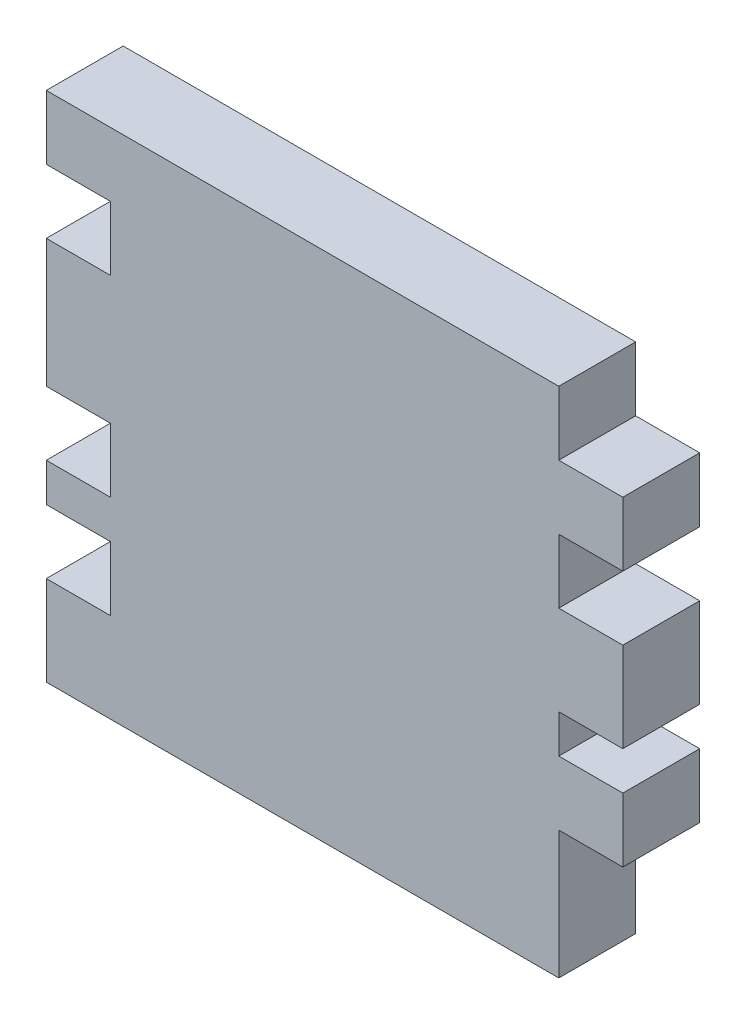
ISO-10303-21;
HEADER;
FILE_DESCRIPTION(('STEP AP214'),'2;1');
FILE_NAME('part.step','',(''),(''),'','','');
FILE_SCHEMA(('AUTOMOTIVE_DESIGN { 1 0 10303 214 1 1 1 1 }'));
ENDSEC;
DATA;
#1=APPLICATION_CONTEXT('core data for automotive mechanical design processes');
#2=APPLICATION_PROTOCOL_DEFINITION('international standard','automotive_design',2000,#1);
#3=PRODUCT_CONTEXT('',#1,'mechanical');
#4=PRODUCT('Part','Part','',(#3));
#5=PRODUCT_RELATED_PRODUCT_CATEGORY('part','',(#4));
#6=PRODUCT_DEFINITION_FORMATION('','',#4);
#7=PRODUCT_DEFINITION_CONTEXT('part definition',#1,'design');
#8=PRODUCT_DEFINITION('design','',#6,#7);
#9=PRODUCT_DEFINITION_SHAPE('','',#8);
#10=(LENGTH_UNIT() NAMED_UNIT(*) SI_UNIT(.MILLI.,.METRE.));
#11=(NAMED_UNIT(*) PLANE_ANGLE_UNIT() SI_UNIT($,.RADIAN.));
#12=(NAMED_UNIT(*) SI_UNIT($,.STERADIAN.) SOLID_ANGLE_UNIT());
#13=UNCERTAINTY_MEASURE_WITH_UNIT(LENGTH_MEASURE(1.E-05),#10,'distance_accuracy_value','');
#14=(GEOMETRIC_REPRESENTATION_CONTEXT(3) GLOBAL_UNCERTAINTY_ASSIGNED_CONTEXT((#13)) GLOBAL_UNIT_ASSIGNED_CONTEXT((#10,
#11,#12)) REPRESENTATION_CONTEXT('',''));
#15=CARTESIAN_POINT('',(0.,0.,0.));
#16=DIRECTION('',(0.,0.,1.));
#17=DIRECTION('',(1.,0.,0.));
#18=AXIS2_PLACEMENT_3D('',#15,#16,#17);
#19=CARTESIAN_POINT('',(0.,0.,6.));
#20=DIRECTION('',(0.,0.,-1.));
#21=DIRECTION('',(-1.,0.,0.));
#22=AXIS2_PLACEMENT_3D('',#19,#20,#21);
#23=PLANE('',#22);
#24=DIRECTION('',(-1.,0.,0.));
#25=VECTOR('',#24,1.);
#26=CARTESIAN_POINT('',(23.7388987566607,12.3845470692718,6.));
#27=LINE('',#26,#25);
#28=CARTESIAN_POINT('',(23.7388987566607,12.3845470692718,6.));
#29=VERTEX_POINT('',#28);
#30=CARTESIAN_POINT('',(18.7388987566607,12.3845470692718,6.));
#31=VERTEX_POINT('',#30);
#32=EDGE_CURVE('E248',#29,#31,#27,.T.);
#33=ORIENTED_EDGE('',*,*,#32,.T.);
#34=DIRECTION('',(0.,-1.,0.));
#35=VECTOR('',#34,1.);
#36=CARTESIAN_POINT('',(18.7388987566607,17.3845470692718,6.));
#37=LINE('',#36,#35);
#38=CARTESIAN_POINT('',(18.7388987566607,17.3845470692718,6.));
#39=VERTEX_POINT('',#38);
#40=EDGE_CURVE('E230',#39,#31,#37,.T.);
#41=ORIENTED_EDGE('',*,*,#40,.F.);
#42=DIRECTION('',(1.,0.,0.));
#43=VECTOR('',#42,1.);
#44=CARTESIAN_POINT('',(-21.2611012433392,17.3845470692718,6.));
#45=LINE('',#44,#43);
#46=CARTESIAN_POINT('',(-21.2611012433392,17.3845470692718,6.));
#47=VERTEX_POINT('',#46);
#48=EDGE_CURVE('E404',#47,#39,#45,.T.);
#49=ORIENTED_EDGE('',*,*,#48,.F.);
#50=DIRECTION('',(0.,-1.,0.));
#51=VECTOR('',#50,1.);
#52=CARTESIAN_POINT('',(-21.2611012433392,17.3845470692718,6.));
#53=LINE('',#52,#51);
#54=CARTESIAN_POINT('',(-21.2611012433393,12.3845470692718,6.));
#55=VERTEX_POINT('',#54);
#56=EDGE_CURVE('E408',#47,#55,#53,.T.);
#57=ORIENTED_EDGE('',*,*,#56,.T.);
#58=DIRECTION('',(1.,0.,0.));
#59=VECTOR('',#58,1.);
#60=CARTESIAN_POINT('',(-21.2611012433393,12.3845470692718,6.));
#61=LINE('',#60,#59);
#62=CARTESIAN_POINT('',(-16.2611012433393,12.3845470692718,6.));
#63=VERTEX_POINT('',#62);
#64=EDGE_CURVE('E328',#55,#63,#61,.T.);
#65=ORIENTED_EDGE('',*,*,#64,.T.);
#66=DIRECTION('',(0.,1.,0.));
#67=VECTOR('',#66,1.);
#68=CARTESIAN_POINT('',(-16.2611012433393,7.38454706927176,6.));
#69=LINE('',#68,#67);
#70=CARTESIAN_POINT('',(-16.2611012433393,7.38454706927176,6.));
#71=VERTEX_POINT('',#70);
#72=EDGE_CURVE('E331',#71,#63,#69,.T.);
#73=ORIENTED_EDGE('',*,*,#72,.F.);
#74=DIRECTION('',(1.,0.,0.));
#75=VECTOR('',#74,1.);
#76=CARTESIAN_POINT('',(-21.2611012433392,7.38454706927176,6.));
#77=LINE('',#76,#75);
#78=CARTESIAN_POINT('',(-21.2611012433392,7.38454706927176,6.));
#79=VERTEX_POINT('',#78);
#80=EDGE_CURVE('E321',#79,#71,#77,.T.);
#81=ORIENTED_EDGE('',*,*,#80,.F.);
#82=CARTESIAN_POINT('',(-21.2611012433393,-2.61545293072824,6.));
#83=VERTEX_POINT('',#82);
#84=EDGE_CURVE('E411',#79,#83,#53,.T.);
#85=ORIENTED_EDGE('',*,*,#84,.T.);
#86=DIRECTION('',(1.,0.,0.));
#87=VECTOR('',#86,1.);
#88=CARTESIAN_POINT('',(-21.2611012433393,-2.61545293072824,6.));
#89=LINE('',#88,#87);
#90=CARTESIAN_POINT('',(-16.2611012433393,-2.61545293072824,6.));
#91=VERTEX_POINT('',#90);
#92=EDGE_CURVE('E332',#83,#91,#89,.T.);
#93=ORIENTED_EDGE('',*,*,#92,.T.);
#94=DIRECTION('',(0.,1.,0.));
#95=VECTOR('',#94,1.);
#96=CARTESIAN_POINT('',(-16.2611012433393,-7.61545293072824,6.));
#97=LINE('',#96,#95);
#98=CARTESIAN_POINT('',(-16.2611012433393,-7.61545293072824,6.));
#99=VERTEX_POINT('',#98);
#100=EDGE_CURVE('E360',#99,#91,#97,.T.);
#101=ORIENTED_EDGE('',*,*,#100,.F.);
#102=DIRECTION('',(1.,0.,0.));
#103=VECTOR('',#102,1.);
#104=CARTESIAN_POINT('',(-21.2611012433392,-7.61545293072824,6.));
#105=LINE('',#104,#103);
#106=CARTESIAN_POINT('',(-21.2611012433392,-7.61545293072824,6.));
#107=VERTEX_POINT('',#106);
#108=EDGE_CURVE('E357',#107,#99,#105,.T.);
#109=ORIENTED_EDGE('',*,*,#108,.F.);
#110=CARTESIAN_POINT('',(-21.2611012433392,-10.6154529307282,6.));
#111=VERTEX_POINT('',#110);
#112=EDGE_CURVE('E439',#107,#111,#53,.T.);
#113=ORIENTED_EDGE('',*,*,#112,.T.);
#114=DIRECTION('',(1.,0.,0.));
#115=VECTOR('',#114,1.);
#116=CARTESIAN_POINT('',(-21.2611012433393,-10.6154529307282,6.));
#117=LINE('',#116,#115);
#118=CARTESIAN_POINT('',(-16.2611012433392,-10.6154529307282,6.));
#119=VERTEX_POINT('',#118);
#120=EDGE_CURVE('E381',#111,#119,#117,.T.);
#121=ORIENTED_EDGE('',*,*,#120,.T.);
#122=DIRECTION('',(0.,-1.,0.));
#123=VECTOR('',#122,1.);
#124=CARTESIAN_POINT('',(-16.2611012433392,-10.6154529307282,6.));
#125=LINE('',#124,#123);
#126=CARTESIAN_POINT('',(-16.2611012433392,-15.6154529307282,6.));
#127=VERTEX_POINT('',#126);
#128=EDGE_CURVE('E384',#119,#127,#125,.T.);
#129=ORIENTED_EDGE('',*,*,#128,.T.);
#130=DIRECTION('',(1.,0.,0.));
#131=VECTOR('',#130,1.);
#132=CARTESIAN_POINT('',(-21.2611012433392,-15.6154529307282,6.));
#133=LINE('',#132,#131);
#134=CARTESIAN_POINT('',(-21.2611012433392,-15.6154529307282,6.));
#135=VERTEX_POINT('',#134);
#136=EDGE_CURVE('E349',#135,#127,#133,.T.);
#137=ORIENTED_EDGE('',*,*,#136,.F.);
#138=CARTESIAN_POINT('',(-21.2611012433392,-22.6154529307282,6.));
#139=VERTEX_POINT('',#138);
#140=EDGE_CURVE('E407',#135,#139,#53,.T.);
#141=ORIENTED_EDGE('',*,*,#140,.T.);
#142=DIRECTION('',(1.,0.,0.));
#143=VECTOR('',#142,1.);
#144=CARTESIAN_POINT('',(-21.2611012433392,-22.6154529307282,6.));
#145=LINE('',#144,#143);
#146=CARTESIAN_POINT('',(18.7388987566607,-22.6154529307282,6.));
#147=VERTEX_POINT('',#146);
#148=EDGE_CURVE('E395',#139,#147,#145,.T.);
#149=ORIENTED_EDGE('',*,*,#148,.T.);
#150=DIRECTION('',(0.,-1.,0.));
#151=VECTOR('',#150,1.);
#152=CARTESIAN_POINT('',(18.7388987566607,-12.6154529307282,6.));
#153=LINE('',#152,#151);
#154=CARTESIAN_POINT('',(18.7388987566607,-12.6154529307282,6.));
#155=VERTEX_POINT('',#154);
#156=EDGE_CURVE('E280',#155,#147,#153,.T.);
#157=ORIENTED_EDGE('',*,*,#156,.F.);
#158=DIRECTION('',(-1.,0.,0.));
#159=VECTOR('',#158,1.);
#160=CARTESIAN_POINT('',(23.7388987566607,-12.6154529307282,6.));
#161=LINE('',#160,#159);
#162=CARTESIAN_POINT('',(23.7388987566607,-12.6154529307282,6.));
#163=VERTEX_POINT('',#162);
#164=EDGE_CURVE('E309',#163,#155,#161,.T.);
#165=ORIENTED_EDGE('',*,*,#164,.F.);
#166=DIRECTION('',(0.,-1.,0.));
#167=VECTOR('',#166,1.);
#168=CARTESIAN_POINT('',(23.7388987566607,17.3845470692718,6.));
#169=LINE('',#168,#167);
#170=CARTESIAN_POINT('',(23.7388987566607,-7.61545293072824,6.));
#171=VERTEX_POINT('',#170);
#172=EDGE_CURVE('E398',#171,#163,#169,.T.);
#173=ORIENTED_EDGE('',*,*,#172,.F.);
#174=DIRECTION('',(-1.,0.,0.));
#175=VECTOR('',#174,1.);
#176=CARTESIAN_POINT('',(23.7388987566607,-7.61545293072824,6.));
#177=LINE('',#176,#175);
#178=CARTESIAN_POINT('',(18.7388987566607,-7.61545293072824,6.));
#179=VERTEX_POINT('',#178);
#180=EDGE_CURVE('E256',#171,#179,#177,.T.);
#181=ORIENTED_EDGE('',*,*,#180,.T.);
#182=DIRECTION('',(0.,-1.,0.));
#183=VECTOR('',#182,1.);
#184=CARTESIAN_POINT('',(18.7388987566607,-4.61545293072824,6.));
#185=LINE('',#184,#183);
#186=CARTESIAN_POINT('',(18.7388987566607,-4.61545293072824,6.));
#187=VERTEX_POINT('',#186);
#188=EDGE_CURVE('E290',#187,#179,#185,.T.);
#189=ORIENTED_EDGE('',*,*,#188,.F.);
#190=DIRECTION('',(-1.,0.,0.));
#191=VECTOR('',#190,1.);
#192=CARTESIAN_POINT('',(23.7388987566607,-4.61545293072824,6.));
#193=LINE('',#192,#191);
#194=CARTESIAN_POINT('',(23.7388987566607,-4.61545293072824,6.));
#195=VERTEX_POINT('',#194);
#196=EDGE_CURVE('E287',#195,#187,#193,.T.);
#197=ORIENTED_EDGE('',*,*,#196,.F.);
#198=CARTESIAN_POINT('',(23.7388987566607,2.38454706927176,6.));
#199=VERTEX_POINT('',#198);
#200=EDGE_CURVE('E402',#199,#195,#169,.T.);
#201=ORIENTED_EDGE('',*,*,#200,.F.);
#202=DIRECTION('',(-1.,0.,0.));
#203=VECTOR('',#202,1.);
#204=CARTESIAN_POINT('',(23.7388987566607,2.38454706927176,6.));
#205=LINE('',#204,#203);
#206=CARTESIAN_POINT('',(18.7388987566607,2.38454706927176,6.));
#207=VERTEX_POINT('',#206);
#208=EDGE_CURVE('E250',#199,#207,#205,.T.);
#209=ORIENTED_EDGE('',*,*,#208,.T.);
#210=DIRECTION('',(0.,-1.,0.));
#211=VECTOR('',#210,1.);
#212=CARTESIAN_POINT('',(18.7388987566607,7.38454706927176,6.));
#213=LINE('',#212,#211);
#214=CARTESIAN_POINT('',(18.7388987566607,7.38454706927176,6.));
#215=VERTEX_POINT('',#214);
#216=EDGE_CURVE('E266',#215,#207,#213,.T.);
#217=ORIENTED_EDGE('',*,*,#216,.F.);
#218=DIRECTION('',(-1.,0.,0.));
#219=VECTOR('',#218,1.);
#220=CARTESIAN_POINT('',(23.7388987566607,7.38454706927176,6.));
#221=LINE('',#220,#219);
#222=CARTESIAN_POINT('',(23.7388987566607,7.38454706927176,6.));
#223=VERTEX_POINT('',#222);
#224=EDGE_CURVE('E263',#223,#215,#221,.T.);
#225=ORIENTED_EDGE('',*,*,#224,.F.);
#226=EDGE_CURVE('E403',#29,#223,#169,.T.);
#227=ORIENTED_EDGE('',*,*,#226,.F.);
#228=EDGE_LOOP('',(#33,#41,#49,#57,#65,#73,#81,#85,#93,#101,#109,#113,#121,#129,#137,#141,#149,
#157,#165,#173,#181,#189,#197,#201,#209,#217,#225,#227));
#229=FACE_BOUND('',#228,.T.);
#230=ADVANCED_FACE('F35',(#229),#23,.F.);
#231=CARTESIAN_POINT('',(0.,0.,0.));
#232=DIRECTION('',(0.,0.,-1.));
#233=DIRECTION('',(-1.,0.,0.));
#234=AXIS2_PLACEMENT_3D('',#231,#232,#233);
#235=PLANE('',#234);
#236=DIRECTION('',(0.,-1.,0.));
#237=VECTOR('',#236,1.);
#238=CARTESIAN_POINT('',(18.7388987566607,17.3845470692718,0.));
#239=LINE('',#238,#237);
#240=CARTESIAN_POINT('',(18.7388987566607,17.3845470692718,0.));
#241=VERTEX_POINT('',#240);
#242=CARTESIAN_POINT('',(18.7388987566607,12.3845470692718,0.));
#243=VERTEX_POINT('',#242);
#244=EDGE_CURVE('E229',#241,#243,#239,.T.);
#245=ORIENTED_EDGE('',*,*,#244,.T.);
#246=DIRECTION('',(-1.,0.,0.));
#247=VECTOR('',#246,1.);
#248=CARTESIAN_POINT('',(23.7388987566607,12.3845470692718,0.));
#249=LINE('',#248,#247);
#250=CARTESIAN_POINT('',(23.7388987566607,12.3845470692718,0.));
#251=VERTEX_POINT('',#250);
#252=EDGE_CURVE('E218',#251,#243,#249,.T.);
#253=ORIENTED_EDGE('',*,*,#252,.F.);
#254=DIRECTION('',(0.,-1.,0.));
#255=VECTOR('',#254,1.);
#256=CARTESIAN_POINT('',(23.7388987566607,17.3845470692718,0.));
#257=LINE('',#256,#255);
#258=CARTESIAN_POINT('',(23.7388987566607,7.38454706927176,0.));
#259=VERTEX_POINT('',#258);
#260=EDGE_CURVE('E418',#251,#259,#257,.T.);
#261=ORIENTED_EDGE('',*,*,#260,.T.);
#262=DIRECTION('',(-1.,0.,0.));
#263=VECTOR('',#262,1.);
#264=CARTESIAN_POINT('',(23.7388987566607,7.38454706927176,0.));
#265=LINE('',#264,#263);
#266=CARTESIAN_POINT('',(18.7388987566607,7.38454706927176,0.));
#267=VERTEX_POINT('',#266);
#268=EDGE_CURVE('E58',#259,#267,#265,.T.);
#269=ORIENTED_EDGE('',*,*,#268,.T.);
#270=DIRECTION('',(0.,-1.,0.));
#271=VECTOR('',#270,1.);
#272=CARTESIAN_POINT('',(18.7388987566607,7.38454706927176,0.));
#273=LINE('',#272,#271);
#274=CARTESIAN_POINT('',(18.7388987566607,2.38454706927176,0.));
#275=VERTEX_POINT('',#274);
#276=EDGE_CURVE('E273',#267,#275,#273,.T.);
#277=ORIENTED_EDGE('',*,*,#276,.T.);
#278=DIRECTION('',(-1.,0.,0.));
#279=VECTOR('',#278,1.);
#280=CARTESIAN_POINT('',(23.7388987566607,2.38454706927176,0.));
#281=LINE('',#280,#279);
#282=CARTESIAN_POINT('',(23.7388987566607,2.38454706927176,0.));
#283=VERTEX_POINT('',#282);
#284=EDGE_CURVE('E267',#283,#275,#281,.T.);
#285=ORIENTED_EDGE('',*,*,#284,.F.);
#286=CARTESIAN_POINT('',(23.7388987566608,-4.61545293072825,0.));
#287=VERTEX_POINT('',#286);
#288=EDGE_CURVE('E417',#283,#287,#257,.T.);
#289=ORIENTED_EDGE('',*,*,#288,.T.);
#290=DIRECTION('',(-1.,0.,0.));
#291=VECTOR('',#290,1.);
#292=CARTESIAN_POINT('',(23.7388987566607,-4.61545293072824,0.));
#293=LINE('',#292,#291);
#294=CARTESIAN_POINT('',(18.7388987566607,-4.61545293072824,0.));
#295=VERTEX_POINT('',#294);
#296=EDGE_CURVE('E50',#287,#295,#293,.T.);
#297=ORIENTED_EDGE('',*,*,#296,.T.);
#298=DIRECTION('',(0.,-1.,0.));
#299=VECTOR('',#298,1.);
#300=CARTESIAN_POINT('',(18.7388987566607,-4.61545293072824,0.));
#301=LINE('',#300,#299);
#302=CARTESIAN_POINT('',(18.7388987566607,-7.61545293072824,0.));
#303=VERTEX_POINT('',#302);
#304=EDGE_CURVE('E297',#295,#303,#301,.T.);
#305=ORIENTED_EDGE('',*,*,#304,.T.);
#306=DIRECTION('',(-1.,0.,0.));
#307=VECTOR('',#306,1.);
#308=CARTESIAN_POINT('',(23.7388987566607,-7.61545293072824,0.));
#309=LINE('',#308,#307);
#310=CARTESIAN_POINT('',(23.7388987566607,-7.61545293072824,0.));
#311=VERTEX_POINT('',#310);
#312=EDGE_CURVE('E291',#311,#303,#309,.T.);
#313=ORIENTED_EDGE('',*,*,#312,.F.);
#314=CARTESIAN_POINT('',(23.7388987566607,-12.6154529307282,0.));
#315=VERTEX_POINT('',#314);
#316=EDGE_CURVE('E414',#311,#315,#257,.T.);
#317=ORIENTED_EDGE('',*,*,#316,.T.);
#318=DIRECTION('',(-1.,0.,0.));
#319=VECTOR('',#318,1.);
#320=CARTESIAN_POINT('',(23.7388987566607,-12.6154529307282,0.));
#321=LINE('',#320,#319);
#322=CARTESIAN_POINT('',(18.7388987566607,-12.6154529307282,0.));
#323=VERTEX_POINT('',#322);
#324=EDGE_CURVE('E308',#315,#323,#321,.T.);
#325=ORIENTED_EDGE('',*,*,#324,.T.);
#326=DIRECTION('',(0.,-1.,0.));
#327=VECTOR('',#326,1.);
#328=CARTESIAN_POINT('',(18.7388987566607,-12.6154529307282,0.));
#329=LINE('',#328,#327);
#330=CARTESIAN_POINT('',(18.7388987566607,-22.6154529307282,0.));
#331=VERTEX_POINT('',#330);
#332=EDGE_CURVE('E312',#323,#331,#329,.T.);
#333=ORIENTED_EDGE('',*,*,#332,.T.);
#334=DIRECTION('',(1.,0.,0.));
#335=VECTOR('',#334,1.);
#336=CARTESIAN_POINT('',(-21.2611012433392,-22.6154529307282,0.));
#337=LINE('',#336,#335);
#338=CARTESIAN_POINT('',(-21.2611012433392,-22.6154529307282,0.));
#339=VERTEX_POINT('',#338);
#340=EDGE_CURVE('E345',#339,#331,#337,.T.);
#341=ORIENTED_EDGE('',*,*,#340,.F.);
#342=DIRECTION('',(0.,-1.,0.));
#343=VECTOR('',#342,1.);
#344=CARTESIAN_POINT('',(-21.2611012433392,17.3845470692718,0.));
#345=LINE('',#344,#343);
#346=CARTESIAN_POINT('',(-21.2611012433392,-15.6154529307282,0.));
#347=VERTEX_POINT('',#346);
#348=EDGE_CURVE('E420',#347,#339,#345,.T.);
#349=ORIENTED_EDGE('',*,*,#348,.F.);
#350=DIRECTION('',(1.,0.,0.));
#351=VECTOR('',#350,1.);
#352=CARTESIAN_POINT('',(-21.2611012433392,-15.6154529307282,0.));
#353=LINE('',#352,#351);
#354=CARTESIAN_POINT('',(-16.2611012433392,-15.6154529307282,0.));
#355=VERTEX_POINT('',#354);
#356=EDGE_CURVE('E385',#347,#355,#353,.T.);
#357=ORIENTED_EDGE('',*,*,#356,.T.);
#358=DIRECTION('',(0.,-1.,0.));
#359=VECTOR('',#358,1.);
#360=CARTESIAN_POINT('',(-16.2611012433392,-10.6154529307282,0.));
#361=LINE('',#360,#359);
#362=CARTESIAN_POINT('',(-16.2611012433392,-10.6154529307282,0.));
#363=VERTEX_POINT('',#362);
#364=EDGE_CURVE('E391',#363,#355,#361,.T.);
#365=ORIENTED_EDGE('',*,*,#364,.F.);
#366=DIRECTION('',(1.,0.,0.));
#367=VECTOR('',#366,1.);
#368=CARTESIAN_POINT('',(-21.2611012433393,-10.6154529307282,0.));
#369=LINE('',#368,#367);
#370=CARTESIAN_POINT('',(-21.2611012433393,-10.6154529307282,0.));
#371=VERTEX_POINT('',#370);
#372=EDGE_CURVE('E374',#371,#363,#369,.T.);
#373=ORIENTED_EDGE('',*,*,#372,.F.);
#374=CARTESIAN_POINT('',(-21.2611012433392,-7.61545293072824,0.));
#375=VERTEX_POINT('',#374);
#376=EDGE_CURVE('E466',#375,#371,#345,.T.);
#377=ORIENTED_EDGE('',*,*,#376,.F.);
#378=DIRECTION('',(1.,0.,0.));
#379=VECTOR('',#378,1.);
#380=CARTESIAN_POINT('',(-21.2611012433392,-7.61545293072824,0.));
#381=LINE('',#380,#379);
#382=CARTESIAN_POINT('',(-16.2611012433393,-7.61545293072824,0.));
#383=VERTEX_POINT('',#382);
#384=EDGE_CURVE('E356',#375,#383,#381,.T.);
#385=ORIENTED_EDGE('',*,*,#384,.T.);
#386=DIRECTION('',(0.,1.,0.));
#387=VECTOR('',#386,1.);
#388=CARTESIAN_POINT('',(-16.2611012433393,-7.61545293072824,0.));
#389=LINE('',#388,#387);
#390=CARTESIAN_POINT('',(-16.2611012433393,-2.61545293072824,0.));
#391=VERTEX_POINT('',#390);
#392=EDGE_CURVE('E368',#383,#391,#389,.T.);
#393=ORIENTED_EDGE('',*,*,#392,.T.);
#394=DIRECTION('',(1.,0.,0.));
#395=VECTOR('',#394,1.);
#396=CARTESIAN_POINT('',(-21.2611012433393,-2.61545293072824,0.));
#397=LINE('',#396,#395);
#398=CARTESIAN_POINT('',(-21.2611012433393,-2.61545293072824,0.));
#399=VERTEX_POINT('',#398);
#400=EDGE_CURVE('E361',#399,#391,#397,.T.);
#401=ORIENTED_EDGE('',*,*,#400,.F.);
#402=CARTESIAN_POINT('',(-21.2611012433392,7.38454706927176,0.));
#403=VERTEX_POINT('',#402);
#404=EDGE_CURVE('E422',#403,#399,#345,.T.);
#405=ORIENTED_EDGE('',*,*,#404,.F.);
#406=DIRECTION('',(1.,0.,0.));
#407=VECTOR('',#406,1.);
#408=CARTESIAN_POINT('',(-21.2611012433392,7.38454706927176,0.));
#409=LINE('',#408,#407);
#410=CARTESIAN_POINT('',(-16.2611012433393,7.38454706927176,0.));
#411=VERTEX_POINT('',#410);
#412=EDGE_CURVE('E324',#403,#411,#409,.T.);
#413=ORIENTED_EDGE('',*,*,#412,.T.);
#414=DIRECTION('',(0.,1.,0.));
#415=VECTOR('',#414,1.);
#416=CARTESIAN_POINT('',(-16.2611012433393,7.38454706927176,0.));
#417=LINE('',#416,#415);
#418=CARTESIAN_POINT('',(-16.2611012433393,12.3845470692718,0.));
#419=VERTEX_POINT('',#418);
#420=EDGE_CURVE('E320',#411,#419,#417,.T.);
#421=ORIENTED_EDGE('',*,*,#420,.T.);
#422=DIRECTION('',(1.,0.,0.));
#423=VECTOR('',#422,1.);
#424=CARTESIAN_POINT('',(-21.2611012433393,12.3845470692718,0.));
#425=LINE('',#424,#423);
#426=CARTESIAN_POINT('',(-21.2611012433393,12.3845470692718,0.));
#427=VERTEX_POINT('',#426);
#428=EDGE_CURVE('E318',#427,#419,#425,.T.);
#429=ORIENTED_EDGE('',*,*,#428,.F.);
#430=CARTESIAN_POINT('',(-21.2611012433392,17.3845470692718,0.));
#431=VERTEX_POINT('',#430);
#432=EDGE_CURVE('E399',#431,#427,#345,.T.);
#433=ORIENTED_EDGE('',*,*,#432,.F.);
#434=DIRECTION('',(1.,0.,0.));
#435=VECTOR('',#434,1.);
#436=CARTESIAN_POINT('',(-21.2611012433392,17.3845470692718,0.));
#437=LINE('',#436,#435);
#438=EDGE_CURVE('E244',#431,#241,#437,.T.);
#439=ORIENTED_EDGE('',*,*,#438,.T.);
#440=EDGE_LOOP('',(#245,#253,#261,#269,#277,#285,#289,#297,#305,#313,#317,#325,#333,#341,#349,
#357,#365,#373,#377,#385,#393,#401,#405,#413,#421,#429,#433,#439));
#441=FACE_BOUND('',#440,.T.);
#442=ADVANCED_FACE('F241',(#441),#235,.T.);
#443=CARTESIAN_POINT('',(23.7388987566607,17.3845470692718,6.));
#444=DIRECTION('',(1.,0.,0.));
#445=DIRECTION('',(0.,1.,0.));
#446=AXIS2_PLACEMENT_3D('',#443,#444,#445);
#447=PLANE('',#446);
#448=ORIENTED_EDGE('',*,*,#260,.F.);
#449=DIRECTION('',(0.,0.,1.));
#450=VECTOR('',#449,1.);
#451=CARTESIAN_POINT('',(23.7388987566607,12.3845470692718,0.));
#452=LINE('',#451,#450);
#453=EDGE_CURVE('E224',#251,#29,#452,.T.);
#454=ORIENTED_EDGE('',*,*,#453,.T.);
#455=ORIENTED_EDGE('',*,*,#226,.T.);
#456=DIRECTION('',(0.,0.,1.));
#457=VECTOR('',#456,1.);
#458=CARTESIAN_POINT('',(23.7388987566607,7.38454706927176,0.));
#459=LINE('',#458,#457);
#460=EDGE_CURVE('E258',#259,#223,#459,.T.);
#461=ORIENTED_EDGE('',*,*,#460,.F.);
#462=EDGE_LOOP('',(#448,#454,#455,#461));
#463=FACE_BOUND('',#462,.T.);
#464=ADVANCED_FACE('F500',(#463),#447,.T.);
#465=ORIENTED_EDGE('',*,*,#288,.F.);
#466=DIRECTION('',(0.,0.,1.));
#467=VECTOR('',#466,1.);
#468=CARTESIAN_POINT('',(23.7388987566607,2.38454706927176,0.));
#469=LINE('',#468,#467);
#470=EDGE_CURVE('E260',#283,#199,#469,.T.);
#471=ORIENTED_EDGE('',*,*,#470,.T.);
#472=ORIENTED_EDGE('',*,*,#200,.T.);
#473=DIRECTION('',(0.,0.,1.));
#474=VECTOR('',#473,1.);
#475=CARTESIAN_POINT('',(23.7388987566607,-4.61545293072824,0.));
#476=LINE('',#475,#474);
#477=EDGE_CURVE('E282',#287,#195,#476,.T.);
#478=ORIENTED_EDGE('',*,*,#477,.F.);
#479=EDGE_LOOP('',(#465,#471,#472,#478));
#480=FACE_BOUND('',#479,.T.);
#481=ADVANCED_FACE('F638',(#480),#447,.T.);
#482=ORIENTED_EDGE('',*,*,#316,.F.);
#483=DIRECTION('',(0.,0.,1.));
#484=VECTOR('',#483,1.);
#485=CARTESIAN_POINT('',(23.7388987566607,-7.61545293072824,0.));
#486=LINE('',#485,#484);
#487=EDGE_CURVE('E284',#311,#171,#486,.T.);
#488=ORIENTED_EDGE('',*,*,#487,.T.);
#489=ORIENTED_EDGE('',*,*,#172,.T.);
#490=DIRECTION('',(0.,0.,1.));
#491=VECTOR('',#490,1.);
#492=CARTESIAN_POINT('',(23.7388987566607,-12.6154529307282,0.));
#493=LINE('',#492,#491);
#494=EDGE_CURVE('E306',#315,#163,#493,.T.);
#495=ORIENTED_EDGE('',*,*,#494,.F.);
#496=EDGE_LOOP('',(#482,#488,#489,#495));
#497=FACE_BOUND('',#496,.T.);
#498=ADVANCED_FACE('F492',(#497),#447,.T.);
#499=CARTESIAN_POINT('',(-21.2611012433392,17.3845470692718,6.));
#500=DIRECTION('',(1.,0.,0.));
#501=DIRECTION('',(0.,1.,0.));
#502=AXIS2_PLACEMENT_3D('',#499,#500,#501);
#503=PLANE('',#502);
#504=DIRECTION('',(0.,0.,1.));
#505=VECTOR('',#504,1.);
#506=CARTESIAN_POINT('',(-21.2611012433393,12.3845470692718,0.));
#507=LINE('',#506,#505);
#508=EDGE_CURVE('E327',#427,#55,#507,.T.);
#509=ORIENTED_EDGE('',*,*,#508,.T.);
#510=ORIENTED_EDGE('',*,*,#56,.F.);
#511=DIRECTION('',(0.,0.,-1.));
#512=VECTOR('',#511,1.);
#513=CARTESIAN_POINT('',(-21.2611012433392,17.3845470692718,6.));
#514=LINE('',#513,#512);
#515=EDGE_CURVE('E11',#47,#431,#514,.T.);
#516=ORIENTED_EDGE('',*,*,#515,.T.);
#517=ORIENTED_EDGE('',*,*,#432,.T.);
#518=EDGE_LOOP('',(#509,#510,#516,#517));
#519=FACE_BOUND('',#518,.T.);
#520=ADVANCED_FACE('F481',(#519),#503,.F.);
#521=ORIENTED_EDGE('',*,*,#84,.F.);
#522=DIRECTION('',(0.,0.,1.));
#523=VECTOR('',#522,1.);
#524=CARTESIAN_POINT('',(-21.2611012433392,7.38454706927176,0.));
#525=LINE('',#524,#523);
#526=EDGE_CURVE('E339',#403,#79,#525,.T.);
#527=ORIENTED_EDGE('',*,*,#526,.F.);
#528=ORIENTED_EDGE('',*,*,#404,.T.);
#529=DIRECTION('',(0.,0.,1.));
#530=VECTOR('',#529,1.);
#531=CARTESIAN_POINT('',(-21.2611012433393,-2.61545293072824,0.));
#532=LINE('',#531,#530);
#533=EDGE_CURVE('E353',#399,#83,#532,.T.);
#534=ORIENTED_EDGE('',*,*,#533,.T.);
#535=EDGE_LOOP('',(#521,#527,#528,#534));
#536=FACE_BOUND('',#535,.T.);
#537=ADVANCED_FACE('F450',(#536),#503,.F.);
#538=ORIENTED_EDGE('',*,*,#112,.F.);
#539=DIRECTION('',(0.,0.,1.));
#540=VECTOR('',#539,1.);
#541=CARTESIAN_POINT('',(-21.2611012433392,-7.61545293072824,0.));
#542=LINE('',#541,#540);
#543=EDGE_CURVE('E351',#375,#107,#542,.T.);
#544=ORIENTED_EDGE('',*,*,#543,.F.);
#545=ORIENTED_EDGE('',*,*,#376,.T.);
#546=DIRECTION('',(0.,0.,1.));
#547=VECTOR('',#546,1.);
#548=CARTESIAN_POINT('',(-21.2611012433393,-10.6154529307282,0.));
#549=LINE('',#548,#547);
#550=EDGE_CURVE('E377',#371,#111,#549,.T.);
#551=ORIENTED_EDGE('',*,*,#550,.T.);
#552=EDGE_LOOP('',(#538,#544,#545,#551));
#553=FACE_BOUND('',#552,.T.);
#554=ADVANCED_FACE('F464',(#553),#503,.F.);
#555=CARTESIAN_POINT('',(-21.2611012433392,17.3845470692718,6.));
#556=DIRECTION('',(0.,1.,0.));
#557=DIRECTION('',(0.,0.,1.));
#558=AXIS2_PLACEMENT_3D('',#555,#556,#557);
#559=PLANE('',#558);
#560=DIRECTION('',(0.,0.,1.));
#561=VECTOR('',#560,1.);
#562=CARTESIAN_POINT('',(18.7388987566607,17.3845470692718,0.));
#563=LINE('',#562,#561);
#564=EDGE_CURVE('E238',#241,#39,#563,.T.);
#565=ORIENTED_EDGE('',*,*,#564,.F.);
#566=ORIENTED_EDGE('',*,*,#438,.F.);
#567=ORIENTED_EDGE('',*,*,#515,.F.);
#568=ORIENTED_EDGE('',*,*,#48,.T.);
#569=EDGE_LOOP('',(#565,#566,#567,#568));
#570=FACE_BOUND('',#569,.T.);
#571=ADVANCED_FACE('F488',(#570),#559,.T.);
#572=CARTESIAN_POINT('',(-21.2611012433392,-22.6154529307282,6.));
#573=DIRECTION('',(0.,1.,0.));
#574=DIRECTION('',(0.,0.,1.));
#575=AXIS2_PLACEMENT_3D('',#572,#573,#574);
#576=PLANE('',#575);
#577=ORIENTED_EDGE('',*,*,#340,.T.);
#578=DIRECTION('',(0.,0.,1.));
#579=VECTOR('',#578,1.);
#580=CARTESIAN_POINT('',(18.7388987566607,-22.6154529307282,0.));
#581=LINE('',#580,#579);
#582=EDGE_CURVE('E301',#331,#147,#581,.T.);
#583=ORIENTED_EDGE('',*,*,#582,.T.);
#584=ORIENTED_EDGE('',*,*,#148,.F.);
#585=DIRECTION('',(0.,0.,-1.));
#586=VECTOR('',#585,1.);
#587=CARTESIAN_POINT('',(-21.2611012433392,-22.6154529307282,6.));
#588=LINE('',#587,#586);
#589=EDGE_CURVE('E43',#139,#339,#588,.T.);
#590=ORIENTED_EDGE('',*,*,#589,.T.);
#591=EDGE_LOOP('',(#577,#583,#584,#590));
#592=FACE_BOUND('',#591,.T.);
#593=ADVANCED_FACE('F37',(#592),#576,.F.);
#594=ORIENTED_EDGE('',*,*,#140,.F.);
#595=DIRECTION('',(0.,0.,1.));
#596=VECTOR('',#595,1.);
#597=CARTESIAN_POINT('',(-21.2611012433392,-15.6154529307282,0.));
#598=LINE('',#597,#596);
#599=EDGE_CURVE('E237',#347,#135,#598,.T.);
#600=ORIENTED_EDGE('',*,*,#599,.F.);
#601=ORIENTED_EDGE('',*,*,#348,.T.);
#602=ORIENTED_EDGE('',*,*,#589,.F.);
#603=EDGE_LOOP('',(#594,#600,#601,#602));
#604=FACE_BOUND('',#603,.T.);
#605=ADVANCED_FACE('F478',(#604),#503,.F.);
#606=CARTESIAN_POINT('',(-21.2611012433392,-15.6154529307282,0.));
#607=DIRECTION('',(0.,-1.,0.));
#608=DIRECTION('',(0.,0.,-1.));
#609=AXIS2_PLACEMENT_3D('',#606,#607,#608);
#610=PLANE('',#609);
#611=ORIENTED_EDGE('',*,*,#136,.T.);
#612=DIRECTION('',(0.,0.,1.));
#613=VECTOR('',#612,1.);
#614=CARTESIAN_POINT('',(-16.2611012433392,-15.6154529307282,0.));
#615=LINE('',#614,#613);
#616=EDGE_CURVE('E372',#355,#127,#615,.T.);
#617=ORIENTED_EDGE('',*,*,#616,.F.);
#618=ORIENTED_EDGE('',*,*,#356,.F.);
#619=ORIENTED_EDGE('',*,*,#599,.T.);
#620=EDGE_LOOP('',(#611,#617,#618,#619));
#621=FACE_BOUND('',#620,.T.);
#622=ADVANCED_FACE('F477',(#621),#610,.F.);
#623=CARTESIAN_POINT('',(-21.2611012433393,-10.6154529307282,0.));
#624=DIRECTION('',(0.,-1.,0.));
#625=DIRECTION('',(0.,0.,-1.));
#626=AXIS2_PLACEMENT_3D('',#623,#624,#625);
#627=PLANE('',#626);
#628=ORIENTED_EDGE('',*,*,#120,.F.);
#629=ORIENTED_EDGE('',*,*,#550,.F.);
#630=ORIENTED_EDGE('',*,*,#372,.T.);
#631=DIRECTION('',(0.,0.,1.));
#632=VECTOR('',#631,1.);
#633=CARTESIAN_POINT('',(-16.2611012433392,-10.6154529307282,0.));
#634=LINE('',#633,#632);
#635=EDGE_CURVE('E375',#363,#119,#634,.T.);
#636=ORIENTED_EDGE('',*,*,#635,.T.);
#637=EDGE_LOOP('',(#628,#629,#630,#636));
#638=FACE_BOUND('',#637,.T.);
#639=ADVANCED_FACE('F469',(#638),#627,.T.);
#640=CARTESIAN_POINT('',(-16.2611012433392,-10.6154529307282,0.));
#641=DIRECTION('',(-1.,0.,0.));
#642=DIRECTION('',(0.,0.,1.));
#643=AXIS2_PLACEMENT_3D('',#640,#641,#642);
#644=PLANE('',#643);
#645=ORIENTED_EDGE('',*,*,#128,.F.);
#646=ORIENTED_EDGE('',*,*,#635,.F.);
#647=ORIENTED_EDGE('',*,*,#364,.T.);
#648=ORIENTED_EDGE('',*,*,#616,.T.);
#649=EDGE_LOOP('',(#645,#646,#647,#648));
#650=FACE_BOUND('',#649,.T.);
#651=ADVANCED_FACE('F475',(#650),#644,.T.);
#652=CARTESIAN_POINT('',(-21.2611012433393,-2.61545293072824,0.));
#653=DIRECTION('',(0.,-1.,0.));
#654=DIRECTION('',(0.,0.,-1.));
#655=AXIS2_PLACEMENT_3D('',#652,#653,#654);
#656=PLANE('',#655);
#657=ORIENTED_EDGE('',*,*,#92,.F.);
#658=ORIENTED_EDGE('',*,*,#533,.F.);
#659=ORIENTED_EDGE('',*,*,#400,.T.);
#660=DIRECTION('',(0.,0.,1.));
#661=VECTOR('',#660,1.);
#662=CARTESIAN_POINT('',(-16.2611012433393,-2.61545293072824,0.));
#663=LINE('',#662,#661);
#664=EDGE_CURVE('E346',#391,#91,#663,.T.);
#665=ORIENTED_EDGE('',*,*,#664,.T.);
#666=EDGE_LOOP('',(#657,#658,#659,#665));
#667=FACE_BOUND('',#666,.T.);
#668=ADVANCED_FACE('F455',(#667),#656,.T.);
#669=CARTESIAN_POINT('',(-16.2611012433393,-7.61545293072824,0.));
#670=DIRECTION('',(1.,0.,0.));
#671=DIRECTION('',(0.,0.,-1.));
#672=AXIS2_PLACEMENT_3D('',#669,#670,#671);
#673=PLANE('',#672);
#674=ORIENTED_EDGE('',*,*,#100,.T.);
#675=ORIENTED_EDGE('',*,*,#664,.F.);
#676=ORIENTED_EDGE('',*,*,#392,.F.);
#677=DIRECTION('',(0.,0.,1.));
#678=VECTOR('',#677,1.);
#679=CARTESIAN_POINT('',(-16.2611012433393,-7.61545293072824,0.));
#680=LINE('',#679,#678);
#681=EDGE_CURVE('E348',#383,#99,#680,.T.);
#682=ORIENTED_EDGE('',*,*,#681,.T.);
#683=EDGE_LOOP('',(#674,#675,#676,#682));
#684=FACE_BOUND('',#683,.T.);
#685=ADVANCED_FACE('F460',(#684),#673,.F.);
#686=CARTESIAN_POINT('',(-21.2611012433392,-7.61545293072824,0.));
#687=DIRECTION('',(0.,-1.,0.));
#688=DIRECTION('',(1.,0.,0.));
#689=AXIS2_PLACEMENT_3D('',#686,#687,#688);
#690=PLANE('',#689);
#691=ORIENTED_EDGE('',*,*,#108,.T.);
#692=ORIENTED_EDGE('',*,*,#681,.F.);
#693=ORIENTED_EDGE('',*,*,#384,.F.);
#694=ORIENTED_EDGE('',*,*,#543,.T.);
#695=EDGE_LOOP('',(#691,#692,#693,#694));
#696=FACE_BOUND('',#695,.T.);
#697=ADVANCED_FACE('F506',(#696),#690,.F.);
#698=CARTESIAN_POINT('',(-21.2611012433393,12.3845470692718,0.));
#699=DIRECTION('',(0.,-1.,0.));
#700=DIRECTION('',(0.,0.,-1.));
#701=AXIS2_PLACEMENT_3D('',#698,#699,#700);
#702=PLANE('',#701);
#703=ORIENTED_EDGE('',*,*,#64,.F.);
#704=ORIENTED_EDGE('',*,*,#508,.F.);
#705=ORIENTED_EDGE('',*,*,#428,.T.);
#706=DIRECTION('',(0.,0.,1.));
#707=VECTOR('',#706,1.);
#708=CARTESIAN_POINT('',(-16.2611012433393,12.3845470692718,0.));
#709=LINE('',#708,#707);
#710=EDGE_CURVE('E343',#419,#63,#709,.T.);
#711=ORIENTED_EDGE('',*,*,#710,.T.);
#712=EDGE_LOOP('',(#703,#704,#705,#711));
#713=FACE_BOUND('',#712,.T.);
#714=ADVANCED_FACE('F509',(#713),#702,.T.);
#715=CARTESIAN_POINT('',(-16.2611012433393,7.38454706927176,0.));
#716=DIRECTION('',(1.,0.,0.));
#717=DIRECTION('',(0.,0.,-1.));
#718=AXIS2_PLACEMENT_3D('',#715,#716,#717);
#719=PLANE('',#718);
#720=ORIENTED_EDGE('',*,*,#72,.T.);
#721=ORIENTED_EDGE('',*,*,#710,.F.);
#722=ORIENTED_EDGE('',*,*,#420,.F.);
#723=DIRECTION('',(0.,0.,1.));
#724=VECTOR('',#723,1.);
#725=CARTESIAN_POINT('',(-16.2611012433393,7.38454706927176,0.));
#726=LINE('',#725,#724);
#727=EDGE_CURVE('E341',#411,#71,#726,.T.);
#728=ORIENTED_EDGE('',*,*,#727,.T.);
#729=EDGE_LOOP('',(#720,#721,#722,#728));
#730=FACE_BOUND('',#729,.T.);
#731=ADVANCED_FACE('F516',(#730),#719,.F.);
#732=CARTESIAN_POINT('',(-21.2611012433392,7.38454706927176,0.));
#733=DIRECTION('',(0.,-1.,0.));
#734=DIRECTION('',(1.,0.,0.));
#735=AXIS2_PLACEMENT_3D('',#732,#733,#734);
#736=PLANE('',#735);
#737=ORIENTED_EDGE('',*,*,#80,.T.);
#738=ORIENTED_EDGE('',*,*,#727,.F.);
#739=ORIENTED_EDGE('',*,*,#412,.F.);
#740=ORIENTED_EDGE('',*,*,#526,.T.);
#741=EDGE_LOOP('',(#737,#738,#739,#740));
#742=FACE_BOUND('',#741,.T.);
#743=ADVANCED_FACE('F520',(#742),#736,.F.);
#744=CARTESIAN_POINT('',(18.7388987566607,-12.6154529307282,0.));
#745=DIRECTION('',(-1.,0.,0.));
#746=DIRECTION('',(0.,0.,1.));
#747=AXIS2_PLACEMENT_3D('',#744,#745,#746);
#748=PLANE('',#747);
#749=ORIENTED_EDGE('',*,*,#156,.T.);
#750=ORIENTED_EDGE('',*,*,#582,.F.);
#751=ORIENTED_EDGE('',*,*,#332,.F.);
#752=DIRECTION('',(0.,0.,1.));
#753=VECTOR('',#752,1.);
#754=CARTESIAN_POINT('',(18.7388987566607,-12.6154529307282,0.));
#755=LINE('',#754,#753);
#756=EDGE_CURVE('E304',#323,#155,#755,.T.);
#757=ORIENTED_EDGE('',*,*,#756,.T.);
#758=EDGE_LOOP('',(#749,#750,#751,#757));
#759=FACE_BOUND('',#758,.T.);
#760=ADVANCED_FACE('F433',(#759),#748,.F.);
#761=CARTESIAN_POINT('',(23.7388987566607,-12.6154529307282,0.));
#762=DIRECTION('',(0.,1.,0.));
#763=DIRECTION('',(-1.,0.,0.));
#764=AXIS2_PLACEMENT_3D('',#761,#762,#763);
#765=PLANE('',#764);
#766=ORIENTED_EDGE('',*,*,#164,.T.);
#767=ORIENTED_EDGE('',*,*,#756,.F.);
#768=ORIENTED_EDGE('',*,*,#324,.F.);
#769=ORIENTED_EDGE('',*,*,#494,.T.);
#770=EDGE_LOOP('',(#766,#767,#768,#769));
#771=FACE_BOUND('',#770,.T.);
#772=ADVANCED_FACE('F524',(#771),#765,.F.);
#773=CARTESIAN_POINT('',(23.7388987566607,12.3845470692718,0.));
#774=DIRECTION('',(0.,1.,0.));
#775=DIRECTION('',(0.,0.,1.));
#776=AXIS2_PLACEMENT_3D('',#773,#774,#775);
#777=PLANE('',#776);
#778=ORIENTED_EDGE('',*,*,#32,.F.);
#779=ORIENTED_EDGE('',*,*,#453,.F.);
#780=ORIENTED_EDGE('',*,*,#252,.T.);
#781=DIRECTION('',(0.,0.,1.));
#782=VECTOR('',#781,1.);
#783=CARTESIAN_POINT('',(18.7388987566607,12.3845470692718,0.));
#784=LINE('',#783,#782);
#785=EDGE_CURVE('E221',#243,#31,#784,.T.);
#786=ORIENTED_EDGE('',*,*,#785,.T.);
#787=EDGE_LOOP('',(#778,#779,#780,#786));
#788=FACE_BOUND('',#787,.T.);
#789=ADVANCED_FACE('F220',(#788),#777,.T.);
#790=CARTESIAN_POINT('',(18.7388987566607,17.3845470692718,0.));
#791=DIRECTION('',(-1.,0.,0.));
#792=DIRECTION('',(0.,0.,1.));
#793=AXIS2_PLACEMENT_3D('',#790,#791,#792);
#794=PLANE('',#793);
#795=ORIENTED_EDGE('',*,*,#40,.T.);
#796=ORIENTED_EDGE('',*,*,#785,.F.);
#797=ORIENTED_EDGE('',*,*,#244,.F.);
#798=ORIENTED_EDGE('',*,*,#564,.T.);
#799=EDGE_LOOP('',(#795,#796,#797,#798));
#800=FACE_BOUND('',#799,.T.);
#801=ADVANCED_FACE('F233',(#800),#794,.F.);
#802=CARTESIAN_POINT('',(23.7388987566607,-7.61545293072824,0.));
#803=DIRECTION('',(0.,1.,0.));
#804=DIRECTION('',(-1.,0.,0.));
#805=AXIS2_PLACEMENT_3D('',#802,#803,#804);
#806=PLANE('',#805);
#807=ORIENTED_EDGE('',*,*,#180,.F.);
#808=ORIENTED_EDGE('',*,*,#487,.F.);
#809=ORIENTED_EDGE('',*,*,#312,.T.);
#810=DIRECTION('',(0.,0.,1.));
#811=VECTOR('',#810,1.);
#812=CARTESIAN_POINT('',(18.7388987566607,-7.61545293072824,0.));
#813=LINE('',#812,#811);
#814=EDGE_CURVE('E277',#303,#179,#813,.T.);
#815=ORIENTED_EDGE('',*,*,#814,.T.);
#816=EDGE_LOOP('',(#807,#808,#809,#815));
#817=FACE_BOUND('',#816,.T.);
#818=ADVANCED_FACE('F537',(#817),#806,.T.);
#819=CARTESIAN_POINT('',(18.7388987566607,-4.61545293072824,0.));
#820=DIRECTION('',(-1.,0.,0.));
#821=DIRECTION('',(0.,0.,1.));
#822=AXIS2_PLACEMENT_3D('',#819,#820,#821);
#823=PLANE('',#822);
#824=ORIENTED_EDGE('',*,*,#188,.T.);
#825=ORIENTED_EDGE('',*,*,#814,.F.);
#826=ORIENTED_EDGE('',*,*,#304,.F.);
#827=DIRECTION('',(0.,0.,1.));
#828=VECTOR('',#827,1.);
#829=CARTESIAN_POINT('',(18.7388987566607,-4.61545293072824,0.));
#830=LINE('',#829,#828);
#831=EDGE_CURVE('E279',#295,#187,#830,.T.);
#832=ORIENTED_EDGE('',*,*,#831,.T.);
#833=EDGE_LOOP('',(#824,#825,#826,#832));
#834=FACE_BOUND('',#833,.T.);
#835=ADVANCED_FACE('F534',(#834),#823,.F.);
#836=CARTESIAN_POINT('',(23.7388987566607,-4.61545293072824,0.));
#837=DIRECTION('',(0.,1.,0.));
#838=DIRECTION('',(-1.,0.,0.));
#839=AXIS2_PLACEMENT_3D('',#836,#837,#838);
#840=PLANE('',#839);
#841=ORIENTED_EDGE('',*,*,#196,.T.);
#842=ORIENTED_EDGE('',*,*,#831,.F.);
#843=ORIENTED_EDGE('',*,*,#296,.F.);
#844=ORIENTED_EDGE('',*,*,#477,.T.);
#845=EDGE_LOOP('',(#841,#842,#843,#844));
#846=FACE_BOUND('',#845,.T.);
#847=ADVANCED_FACE('F530',(#846),#840,.F.);
#848=CARTESIAN_POINT('',(23.7388987566607,2.38454706927176,0.));
#849=DIRECTION('',(0.,1.,0.));
#850=DIRECTION('',(-1.,0.,0.));
#851=AXIS2_PLACEMENT_3D('',#848,#849,#850);
#852=PLANE('',#851);
#853=ORIENTED_EDGE('',*,*,#208,.F.);
#854=ORIENTED_EDGE('',*,*,#470,.F.);
#855=ORIENTED_EDGE('',*,*,#284,.T.);
#856=DIRECTION('',(0.,0.,1.));
#857=VECTOR('',#856,1.);
#858=CARTESIAN_POINT('',(18.7388987566607,2.38454706927176,0.));
#859=LINE('',#858,#857);
#860=EDGE_CURVE('E253',#275,#207,#859,.T.);
#861=ORIENTED_EDGE('',*,*,#860,.T.);
#862=EDGE_LOOP('',(#853,#854,#855,#861));
#863=FACE_BOUND('',#862,.T.);
#864=ADVANCED_FACE('F533',(#863),#852,.T.);
#865=CARTESIAN_POINT('',(18.7388987566607,7.38454706927176,0.));
#866=DIRECTION('',(-1.,0.,0.));
#867=DIRECTION('',(0.,0.,1.));
#868=AXIS2_PLACEMENT_3D('',#865,#866,#867);
#869=PLANE('',#868);
#870=ORIENTED_EDGE('',*,*,#216,.T.);
#871=ORIENTED_EDGE('',*,*,#860,.F.);
#872=ORIENTED_EDGE('',*,*,#276,.F.);
#873=DIRECTION('',(0.,0.,1.));
#874=VECTOR('',#873,1.);
#875=CARTESIAN_POINT('',(18.7388987566607,7.38454706927176,0.));
#876=LINE('',#875,#874);
#877=EDGE_CURVE('E255',#267,#215,#876,.T.);
#878=ORIENTED_EDGE('',*,*,#877,.T.);
#879=EDGE_LOOP('',(#870,#871,#872,#878));
#880=FACE_BOUND('',#879,.T.);
#881=ADVANCED_FACE('F545',(#880),#869,.F.);
#882=CARTESIAN_POINT('',(23.7388987566607,7.38454706927176,0.));
#883=DIRECTION('',(0.,1.,0.));
#884=DIRECTION('',(0.,0.,1.));
#885=AXIS2_PLACEMENT_3D('',#882,#883,#884);
#886=PLANE('',#885);
#887=ORIENTED_EDGE('',*,*,#224,.T.);
#888=ORIENTED_EDGE('',*,*,#877,.F.);
#889=ORIENTED_EDGE('',*,*,#268,.F.);
#890=ORIENTED_EDGE('',*,*,#460,.T.);
#891=EDGE_LOOP('',(#887,#888,#889,#890));
#892=FACE_BOUND('',#891,.T.);
#893=ADVANCED_FACE('F542',(#892),#886,.F.);
#894=CLOSED_SHELL('',(#230,#442,#464,#481,#498,#520,#537,#554,#571,#593,#605,#622,#639,#651,
#668,#685,#697,#714,#731,#743,#760,#772,#789,#801,#818,#835,#847,#864,#881,#893));
#895=MANIFOLD_SOLID_BREP('B2',#894);
#896=ADVANCED_BREP_SHAPE_REPRESENTATION('',(#18,#895),#14);
#897=SHAPE_DEFINITION_REPRESENTATION(#9,#896);
ENDSEC;
END-ISO-10303-21;
